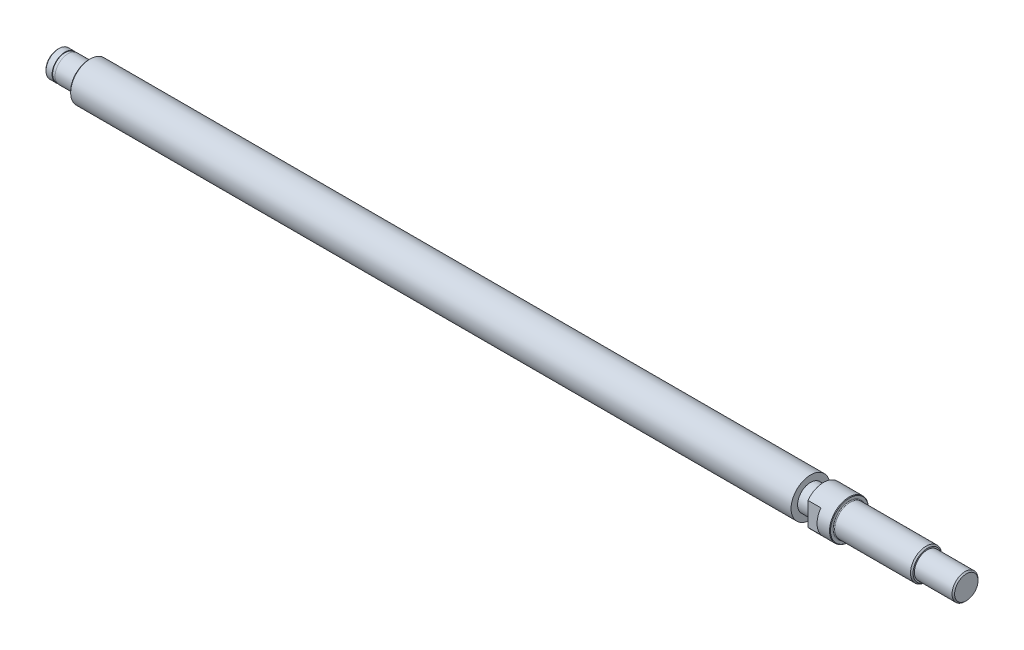
ISO-10303-21;
HEADER;
FILE_DESCRIPTION(('STEP AP214'),'2;1');
FILE_NAME('part.step','',(''),(''),'','','');
FILE_SCHEMA(('AUTOMOTIVE_DESIGN { 1 0 10303 214 1 1 1 1 }'));
ENDSEC;
DATA;
#1=APPLICATION_CONTEXT('core data for automotive mechanical design processes');
#2=APPLICATION_PROTOCOL_DEFINITION('international standard','automotive_design',2000,#1);
#3=PRODUCT_CONTEXT('',#1,'mechanical');
#4=PRODUCT('Part','Part','',(#3));
#5=PRODUCT_RELATED_PRODUCT_CATEGORY('part','',(#4));
#6=PRODUCT_DEFINITION_FORMATION('','',#4);
#7=PRODUCT_DEFINITION_CONTEXT('part definition',#1,'design');
#8=PRODUCT_DEFINITION('design','',#6,#7);
#9=PRODUCT_DEFINITION_SHAPE('','',#8);
#10=(LENGTH_UNIT() NAMED_UNIT(*) SI_UNIT(.MILLI.,.METRE.));
#11=(NAMED_UNIT(*) PLANE_ANGLE_UNIT() SI_UNIT($,.RADIAN.));
#12=(NAMED_UNIT(*) SI_UNIT($,.STERADIAN.) SOLID_ANGLE_UNIT());
#13=UNCERTAINTY_MEASURE_WITH_UNIT(LENGTH_MEASURE(1.E-05),#10,'distance_accuracy_value','');
#14=(GEOMETRIC_REPRESENTATION_CONTEXT(3) GLOBAL_UNCERTAINTY_ASSIGNED_CONTEXT((#13)) GLOBAL_UNIT_ASSIGNED_CONTEXT((#10,
#11,#12)) REPRESENTATION_CONTEXT('',''));
#15=CARTESIAN_POINT('',(0.,0.,0.));
#16=DIRECTION('',(0.,0.,1.));
#17=DIRECTION('',(1.,0.,0.));
#18=AXIS2_PLACEMENT_3D('',#15,#16,#17);
#19=CARTESIAN_POINT('',(295.,-7.66231773470438,6.));
#20=DIRECTION('',(-1.,0.,0.));
#21=DIRECTION('',(0.,1.,0.));
#22=AXIS2_PLACEMENT_3D('',#19,#20,#21);
#23=PLANE('',#22);
#24=CARTESIAN_POINT('',(295.,0.,0.));
#25=DIRECTION('',(-1.,0.,0.));
#26=DIRECTION('',(0.,0.6,0.8));
#27=AXIS2_PLACEMENT_3D('',#24,#25,#26);
#28=CIRCLE('',#27,7.5);
#29=CARTESIAN_POINT('',(295.,4.5,-6.));
#30=VERTEX_POINT('',#29);
#31=CARTESIAN_POINT('',(295.,4.5,6.));
#32=VERTEX_POINT('',#31);
#33=EDGE_CURVE('E56',#30,#32,#28,.F.);
#34=ORIENTED_EDGE('',*,*,#33,.F.);
#35=DIRECTION('',(0.,-1.,0.));
#36=VECTOR('',#35,1.);
#37=CARTESIAN_POINT('',(295.,4.5,-6.));
#38=LINE('',#37,#36);
#39=CARTESIAN_POINT('',(295.,-4.5,-6.));
#40=VERTEX_POINT('',#39);
#41=EDGE_CURVE('E70',#30,#40,#38,.T.);
#42=ORIENTED_EDGE('',*,*,#41,.T.);
#43=CARTESIAN_POINT('',(295.,0.,0.));
#44=DIRECTION('',(-1.,0.,0.));
#45=DIRECTION('',(0.,-0.6,-0.8));
#46=AXIS2_PLACEMENT_3D('',#43,#44,#45);
#47=CIRCLE('',#46,7.5);
#48=CARTESIAN_POINT('',(295.,-4.5,6.));
#49=VERTEX_POINT('',#48);
#50=EDGE_CURVE('E76',#49,#40,#47,.F.);
#51=ORIENTED_EDGE('',*,*,#50,.F.);
#52=DIRECTION('',(0.,1.,0.));
#53=VECTOR('',#52,1.);
#54=CARTESIAN_POINT('',(295.,-4.5,6.));
#55=LINE('',#54,#53);
#56=EDGE_CURVE('E72',#49,#32,#55,.T.);
#57=ORIENTED_EDGE('',*,*,#56,.T.);
#58=EDGE_LOOP('',(#34,#42,#51,#57));
#59=FACE_BOUND('',#58,.T.);
#60=CARTESIAN_POINT('',(295.,0.,0.));
#61=DIRECTION('',(1.,0.,0.));
#62=DIRECTION('',(0.,-1.42053906238006E-07,0.99999999999999));
#63=AXIS2_PLACEMENT_3D('',#60,#61,#62);
#64=CIRCLE('',#63,5.);
#65=CARTESIAN_POINT('',(295.,-7.10269531190032E-07,4.99999999999995));
#66=VERTEX_POINT('',#65);
#67=EDGE_CURVE('E87',#66,#66,#64,.T.);
#68=ORIENTED_EDGE('',*,*,#67,.T.);
#69=EDGE_LOOP('',(#68));
#70=FACE_BOUND('',#69,.T.);
#71=ADVANCED_FACE('F16',(#59,#70),#23,.T.);
#72=CARTESIAN_POINT('',(290.,-7.70492968244106,-7.5));
#73=DIRECTION('',(1.,0.,0.));
#74=DIRECTION('',(0.,1.,0.));
#75=AXIS2_PLACEMENT_3D('',#72,#73,#74);
#76=PLANE('',#75);
#77=CARTESIAN_POINT('',(290.,0.,0.));
#78=DIRECTION('',(1.,0.,0.));
#79=DIRECTION('',(0.,0.,1.));
#80=AXIS2_PLACEMENT_3D('',#77,#78,#79);
#81=CIRCLE('',#80,7.5);
#82=CARTESIAN_POINT('',(290.,0.,7.5));
#83=VERTEX_POINT('',#82);
#84=EDGE_CURVE('E92',#83,#83,#81,.T.);
#85=ORIENTED_EDGE('',*,*,#84,.T.);
#86=EDGE_LOOP('',(#85));
#87=FACE_BOUND('',#86,.T.);
#88=CARTESIAN_POINT('',(290.,0.,0.));
#89=DIRECTION('',(-1.,0.,0.));
#90=DIRECTION('',(0.,0.,-1.));
#91=AXIS2_PLACEMENT_3D('',#88,#89,#90);
#92=CIRCLE('',#91,5.);
#93=CARTESIAN_POINT('',(290.,0.,-5.));
#94=VERTEX_POINT('',#93);
#95=EDGE_CURVE('E95',#94,#94,#92,.F.);
#96=ORIENTED_EDGE('',*,*,#95,.F.);
#97=EDGE_LOOP('',(#96));
#98=FACE_BOUND('',#97,.T.);
#99=ADVANCED_FACE('F216',(#87,#98),#76,.T.);
#100=CARTESIAN_POINT('',(305.,-7.49946489090929,-7.3));
#101=DIRECTION('',(1.,0.,0.));
#102=DIRECTION('',(0.,1.,0.));
#103=AXIS2_PLACEMENT_3D('',#100,#101,#102);
#104=PLANE('',#103);
#105=CARTESIAN_POINT('',(305.,0.,0.));
#106=DIRECTION('',(1.,0.,0.));
#107=DIRECTION('',(0.,0.,1.));
#108=AXIS2_PLACEMENT_3D('',#105,#106,#107);
#109=CIRCLE('',#108,7.29999999999999);
#110=CARTESIAN_POINT('',(305.,0.,7.29999999999999));
#111=VERTEX_POINT('',#110);
#112=EDGE_CURVE('E98',#111,#111,#109,.T.);
#113=ORIENTED_EDGE('',*,*,#112,.T.);
#114=EDGE_LOOP('',(#113));
#115=FACE_BOUND('',#114,.T.);
#116=CARTESIAN_POINT('',(305.,0.,0.));
#117=DIRECTION('',(-1.,0.,0.));
#118=DIRECTION('',(0.,0.,-1.));
#119=AXIS2_PLACEMENT_3D('',#116,#117,#118);
#120=CIRCLE('',#119,6.30000007095759);
#121=CARTESIAN_POINT('',(305.,0.,-6.30000007095759));
#122=VERTEX_POINT('',#121);
#123=EDGE_CURVE('E101',#122,#122,#120,.F.);
#124=ORIENTED_EDGE('',*,*,#123,.F.);
#125=EDGE_LOOP('',(#124));
#126=FACE_BOUND('',#125,.T.);
#127=ADVANCED_FACE('F221',(#115,#126),#104,.T.);
#128=CARTESIAN_POINT('',(335.,-5.5,-5.5));
#129=DIRECTION('',(1.,0.,0.));
#130=DIRECTION('',(0.,1.,0.));
#131=AXIS2_PLACEMENT_3D('',#128,#129,#130);
#132=PLANE('',#131);
#133=CARTESIAN_POINT('',(335.,0.,0.));
#134=DIRECTION('',(1.,0.,0.));
#135=DIRECTION('',(0.,0.,1.));
#136=AXIS2_PLACEMENT_3D('',#133,#134,#135);
#137=CIRCLE('',#136,5.5);
#138=CARTESIAN_POINT('',(335.,0.,5.5));
#139=VERTEX_POINT('',#138);
#140=EDGE_CURVE('E104',#139,#139,#137,.T.);
#141=ORIENTED_EDGE('',*,*,#140,.T.);
#142=EDGE_LOOP('',(#141));
#143=FACE_BOUND('',#142,.T.);
#144=CARTESIAN_POINT('',(335.,0.,0.));
#145=DIRECTION('',(-1.,0.,0.));
#146=DIRECTION('',(0.,0.,-1.));
#147=AXIS2_PLACEMENT_3D('',#144,#145,#146);
#148=CIRCLE('',#147,5.);
#149=CARTESIAN_POINT('',(335.,0.,-5.));
#150=VERTEX_POINT('',#149);
#151=EDGE_CURVE('E107',#150,#150,#148,.F.);
#152=ORIENTED_EDGE('',*,*,#151,.F.);
#153=EDGE_LOOP('',(#152));
#154=FACE_BOUND('',#153,.T.);
#155=ADVANCED_FACE('F227',(#143,#154),#132,.T.);
#156=CARTESIAN_POINT('',(350.,-4.5,-4.5));
#157=DIRECTION('',(1.,0.,0.));
#158=DIRECTION('',(0.,1.,0.));
#159=AXIS2_PLACEMENT_3D('',#156,#157,#158);
#160=PLANE('',#159);
#161=CARTESIAN_POINT('',(350.,0.,0.));
#162=DIRECTION('',(1.,0.,0.));
#163=DIRECTION('',(0.,0.,1.));
#164=AXIS2_PLACEMENT_3D('',#161,#162,#163);
#165=CIRCLE('',#164,4.5);
#166=CARTESIAN_POINT('',(350.,0.,4.5));
#167=VERTEX_POINT('',#166);
#168=EDGE_CURVE('E110',#167,#167,#165,.T.);
#169=ORIENTED_EDGE('',*,*,#168,.T.);
#170=EDGE_LOOP('',(#169));
#171=FACE_BOUND('',#170,.T.);
#172=ADVANCED_FACE('F211',(#171),#160,.T.);
#173=CARTESIAN_POINT('',(12.,-7.19126770361166,7.));
#174=DIRECTION('',(-1.,0.,0.));
#175=DIRECTION('',(0.,1.,0.));
#176=AXIS2_PLACEMENT_3D('',#173,#174,#175);
#177=PLANE('',#176);
#178=CARTESIAN_POINT('',(12.,0.,0.));
#179=DIRECTION('',(-1.,0.,0.));
#180=DIRECTION('',(0.,0.,-1.));
#181=AXIS2_PLACEMENT_3D('',#178,#179,#180);
#182=CIRCLE('',#181,7.);
#183=CARTESIAN_POINT('',(12.,0.,-7.));
#184=VERTEX_POINT('',#183);
#185=EDGE_CURVE('E113',#184,#184,#182,.F.);
#186=ORIENTED_EDGE('',*,*,#185,.F.);
#187=EDGE_LOOP('',(#186));
#188=FACE_BOUND('',#187,.T.);
#189=CARTESIAN_POINT('',(12.,0.,0.));
#190=DIRECTION('',(1.,0.,0.));
#191=DIRECTION('',(0.,0.,1.));
#192=AXIS2_PLACEMENT_3D('',#189,#190,#191);
#193=CIRCLE('',#192,5.3);
#194=CARTESIAN_POINT('',(12.,0.,5.3));
#195=VERTEX_POINT('',#194);
#196=EDGE_CURVE('E116',#195,#195,#193,.T.);
#197=ORIENTED_EDGE('',*,*,#196,.T.);
#198=EDGE_LOOP('',(#197));
#199=FACE_BOUND('',#198,.T.);
#200=ADVANCED_FACE('F204',(#188,#199),#177,.T.);
#201=CARTESIAN_POINT('',(2.85,-4.99999975726073,-5.00000000000001));
#202=DIRECTION('',(1.,0.,0.));
#203=DIRECTION('',(0.,1.,0.));
#204=AXIS2_PLACEMENT_3D('',#201,#202,#203);
#205=PLANE('',#204);
#206=CARTESIAN_POINT('',(2.85,0.,0.));
#207=DIRECTION('',(1.,0.,0.));
#208=DIRECTION('',(0.,-1.42331253982776E-07,0.99999999999999));
#209=AXIS2_PLACEMENT_3D('',#206,#207,#208);
#210=CIRCLE('',#209,5.);
#211=CARTESIAN_POINT('',(2.85,-7.11656269913877E-07,4.99999999999995));
#212=VERTEX_POINT('',#211);
#213=EDGE_CURVE('E119',#212,#212,#210,.F.);
#214=ORIENTED_EDGE('',*,*,#213,.F.);
#215=EDGE_LOOP('',(#214));
#216=FACE_BOUND('',#215,.T.);
#217=CARTESIAN_POINT('',(2.85,0.,0.));
#218=DIRECTION('',(-1.,0.,0.));
#219=DIRECTION('',(0.,0.,-1.));
#220=AXIS2_PLACEMENT_3D('',#217,#218,#219);
#221=CIRCLE('',#220,4.8);
#222=CARTESIAN_POINT('',(2.85,0.,-4.8));
#223=VERTEX_POINT('',#222);
#224=EDGE_CURVE('E122',#223,#223,#221,.F.);
#225=ORIENTED_EDGE('',*,*,#224,.F.);
#226=EDGE_LOOP('',(#225));
#227=FACE_BOUND('',#226,.T.);
#228=ADVANCED_FACE('F191',(#216,#227),#205,.T.);
#229=CARTESIAN_POINT('',(4.,-5.,5.));
#230=DIRECTION('',(-1.,0.,0.));
#231=DIRECTION('',(0.,1.,0.));
#232=AXIS2_PLACEMENT_3D('',#229,#230,#231);
#233=PLANE('',#232);
#234=CARTESIAN_POINT('',(4.,0.,0.));
#235=DIRECTION('',(-1.,0.,0.));
#236=DIRECTION('',(0.,0.,-1.));
#237=AXIS2_PLACEMENT_3D('',#234,#235,#236);
#238=CIRCLE('',#237,5.);
#239=CARTESIAN_POINT('',(4.,0.,-5.));
#240=VERTEX_POINT('',#239);
#241=EDGE_CURVE('E125',#240,#240,#238,.F.);
#242=ORIENTED_EDGE('',*,*,#241,.F.);
#243=EDGE_LOOP('',(#242));
#244=FACE_BOUND('',#243,.T.);
#245=CARTESIAN_POINT('',(4.,0.,0.));
#246=DIRECTION('',(1.,0.,0.));
#247=DIRECTION('',(0.,-1.41766347920107E-07,0.99999999999999));
#248=AXIS2_PLACEMENT_3D('',#245,#246,#247);
#249=CIRCLE('',#248,4.8);
#250=CARTESIAN_POINT('',(4.,-6.80478470016513E-07,4.79999999999995));
#251=VERTEX_POINT('',#250);
#252=EDGE_CURVE('E128',#251,#251,#249,.T.);
#253=ORIENTED_EDGE('',*,*,#252,.T.);
#254=EDGE_LOOP('',(#253));
#255=FACE_BOUND('',#254,.T.);
#256=ADVANCED_FACE('F187',(#244,#255),#233,.T.);
#257=CARTESIAN_POINT('',(0.,-4.5,4.5));
#258=DIRECTION('',(-1.,0.,0.));
#259=DIRECTION('',(0.,1.,0.));
#260=AXIS2_PLACEMENT_3D('',#257,#258,#259);
#261=PLANE('',#260);
#262=CARTESIAN_POINT('',(0.,0.,0.));
#263=DIRECTION('',(-1.,0.,0.));
#264=DIRECTION('',(0.,0.,-1.));
#265=AXIS2_PLACEMENT_3D('',#262,#263,#264);
#266=CIRCLE('',#265,4.5);
#267=CARTESIAN_POINT('',(0.,0.,-4.5));
#268=VERTEX_POINT('',#267);
#269=EDGE_CURVE('E131',#268,#268,#266,.F.);
#270=ORIENTED_EDGE('',*,*,#269,.F.);
#271=EDGE_LOOP('',(#270));
#272=FACE_BOUND('',#271,.T.);
#273=ADVANCED_FACE('F190',(#272),#261,.T.);
#274=CARTESIAN_POINT('',(300.,-4.5,-6.));
#275=DIRECTION('',(-1.,0.,0.));
#276=DIRECTION('',(0.,1.,0.));
#277=AXIS2_PLACEMENT_3D('',#274,#275,#276);
#278=PLANE('',#277);
#279=DIRECTION('',(0.,1.,0.));
#280=VECTOR('',#279,1.);
#281=CARTESIAN_POINT('',(300.,-4.5,-6.));
#282=LINE('',#281,#280);
#283=CARTESIAN_POINT('',(300.,4.5,-6.));
#284=VERTEX_POINT('',#283);
#285=CARTESIAN_POINT('',(300.,-4.5,-6.));
#286=VERTEX_POINT('',#285);
#287=EDGE_CURVE('E134',#284,#286,#282,.F.);
#288=ORIENTED_EDGE('',*,*,#287,.F.);
#289=CARTESIAN_POINT('',(300.,0.,0.));
#290=DIRECTION('',(-1.,0.,0.));
#291=DIRECTION('',(0.,0.,-1.));
#292=AXIS2_PLACEMENT_3D('',#289,#290,#291);
#293=CIRCLE('',#292,7.5);
#294=EDGE_CURVE('E58',#286,#284,#293,.F.);
#295=ORIENTED_EDGE('',*,*,#294,.F.);
#296=EDGE_LOOP('',(#288,#295));
#297=FACE_BOUND('',#296,.T.);
#298=ADVANCED_FACE('F274',(#297),#278,.T.);
#299=CARTESIAN_POINT('',(300.,-4.5,-6.));
#300=DIRECTION('',(0.,0.,-1.));
#301=DIRECTION('',(-1.,0.,0.));
#302=AXIS2_PLACEMENT_3D('',#299,#300,#301);
#303=PLANE('',#302);
#304=DIRECTION('',(1.,0.,0.));
#305=VECTOR('',#304,1.);
#306=CARTESIAN_POINT('',(295.,4.5,-6.));
#307=LINE('',#306,#305);
#308=EDGE_CURVE('E53',#30,#284,#307,.T.);
#309=ORIENTED_EDGE('',*,*,#308,.T.);
#310=ORIENTED_EDGE('',*,*,#287,.T.);
#311=DIRECTION('',(-1.,0.,0.));
#312=VECTOR('',#311,1.);
#313=CARTESIAN_POINT('',(300.,-4.5,-6.));
#314=LINE('',#313,#312);
#315=EDGE_CURVE('E63',#286,#40,#314,.T.);
#316=ORIENTED_EDGE('',*,*,#315,.T.);
#317=ORIENTED_EDGE('',*,*,#41,.F.);
#318=EDGE_LOOP('',(#309,#310,#316,#317));
#319=FACE_BOUND('',#318,.T.);
#320=ADVANCED_FACE('F75',(#319),#303,.T.);
#321=CARTESIAN_POINT('',(295.,-4.5,6.));
#322=DIRECTION('',(0.,0.,1.));
#323=DIRECTION('',(1.,0.,0.));
#324=AXIS2_PLACEMENT_3D('',#321,#322,#323);
#325=PLANE('',#324);
#326=DIRECTION('',(1.,0.,0.));
#327=VECTOR('',#326,1.);
#328=CARTESIAN_POINT('',(295.,-4.5,6.));
#329=LINE('',#328,#327);
#330=CARTESIAN_POINT('',(300.,-4.5,6.));
#331=VERTEX_POINT('',#330);
#332=EDGE_CURVE('E144',#49,#331,#329,.T.);
#333=ORIENTED_EDGE('',*,*,#332,.T.);
#334=DIRECTION('',(0.,1.,0.));
#335=VECTOR('',#334,1.);
#336=CARTESIAN_POINT('',(300.,-4.5,6.));
#337=LINE('',#336,#335);
#338=CARTESIAN_POINT('',(300.,4.5,6.));
#339=VERTEX_POINT('',#338);
#340=EDGE_CURVE('E148',#331,#339,#337,.T.);
#341=ORIENTED_EDGE('',*,*,#340,.T.);
#342=DIRECTION('',(-1.,0.,0.));
#343=VECTOR('',#342,1.);
#344=CARTESIAN_POINT('',(300.,4.5,6.));
#345=LINE('',#344,#343);
#346=EDGE_CURVE('E31',#339,#32,#345,.T.);
#347=ORIENTED_EDGE('',*,*,#346,.T.);
#348=ORIENTED_EDGE('',*,*,#56,.F.);
#349=EDGE_LOOP('',(#333,#341,#347,#348));
#350=FACE_BOUND('',#349,.T.);
#351=ADVANCED_FACE('F284',(#350),#325,.T.);
#352=CARTESIAN_POINT('',(300.,-4.5,7.5));
#353=DIRECTION('',(-1.,0.,0.));
#354=DIRECTION('',(0.,1.,0.));
#355=AXIS2_PLACEMENT_3D('',#352,#353,#354);
#356=PLANE('',#355);
#357=ORIENTED_EDGE('',*,*,#340,.F.);
#358=CARTESIAN_POINT('',(300.,0.,0.));
#359=DIRECTION('',(-1.,0.,0.));
#360=DIRECTION('',(0.,0.,1.));
#361=AXIS2_PLACEMENT_3D('',#358,#359,#360);
#362=CIRCLE('',#361,7.5);
#363=EDGE_CURVE('E35',#339,#331,#362,.F.);
#364=ORIENTED_EDGE('',*,*,#363,.F.);
#365=EDGE_LOOP('',(#357,#364));
#366=FACE_BOUND('',#365,.T.);
#367=ADVANCED_FACE('F287',(#366),#356,.T.);
#368=CARTESIAN_POINT('',(350.,0.,0.));
#369=DIRECTION('',(1.,0.,0.));
#370=DIRECTION('',(0.,0.,1.));
#371=AXIS2_PLACEMENT_3D('',#368,#369,#370);
#372=CYLINDRICAL_SURFACE('',#371,7.5);
#373=CARTESIAN_POINT('',(304.8,0.,0.));
#374=DIRECTION('',(-1.,0.,0.));
#375=DIRECTION('',(0.,0.,-1.));
#376=AXIS2_PLACEMENT_3D('',#373,#374,#375);
#377=CIRCLE('',#376,7.5);
#378=CARTESIAN_POINT('',(304.8,0.,-7.5));
#379=VERTEX_POINT('',#378);
#380=EDGE_CURVE('E159',#379,#379,#377,.F.);
#381=ORIENTED_EDGE('',*,*,#380,.F.);
#382=EDGE_LOOP('',(#381));
#383=FACE_BOUND('',#382,.T.);
#384=ORIENTED_EDGE('',*,*,#332,.F.);
#385=ORIENTED_EDGE('',*,*,#50,.T.);
#386=ORIENTED_EDGE('',*,*,#315,.F.);
#387=ORIENTED_EDGE('',*,*,#294,.T.);
#388=ORIENTED_EDGE('',*,*,#308,.F.);
#389=ORIENTED_EDGE('',*,*,#33,.T.);
#390=ORIENTED_EDGE('',*,*,#346,.F.);
#391=ORIENTED_EDGE('',*,*,#363,.T.);
#392=EDGE_LOOP('',(#384,#385,#386,#387,#388,#389,#390,#391));
#393=FACE_BOUND('',#392,.T.);
#394=ADVANCED_FACE('F55',(#383,#393),#372,.T.);
#395=CARTESIAN_POINT('',(350.,0.,0.));
#396=DIRECTION('',(1.,0.,0.));
#397=DIRECTION('',(0.,0.,1.));
#398=AXIS2_PLACEMENT_3D('',#395,#396,#397);
#399=CYLINDRICAL_SURFACE('',#398,7.5);
#400=ORIENTED_EDGE('',*,*,#84,.F.);
#401=EDGE_LOOP('',(#400));
#402=FACE_BOUND('',#401,.T.);
#403=CARTESIAN_POINT('',(12.5,0.,0.));
#404=DIRECTION('',(1.,0.,0.));
#405=DIRECTION('',(0.,0.,1.));
#406=AXIS2_PLACEMENT_3D('',#403,#404,#405);
#407=CIRCLE('',#406,7.5);
#408=CARTESIAN_POINT('',(12.5,0.,7.5));
#409=VERTEX_POINT('',#408);
#410=EDGE_CURVE('E164',#409,#409,#407,.T.);
#411=ORIENTED_EDGE('',*,*,#410,.T.);
#412=EDGE_LOOP('',(#411));
#413=FACE_BOUND('',#412,.T.);
#414=ADVANCED_FACE('F294',(#402,#413),#399,.T.);
#415=CARTESIAN_POINT('',(350.,0.,0.));
#416=DIRECTION('',(1.,0.,0.));
#417=DIRECTION('',(0.,0.,1.));
#418=AXIS2_PLACEMENT_3D('',#415,#416,#417);
#419=CYLINDRICAL_SURFACE('',#418,5.);
#420=ORIENTED_EDGE('',*,*,#67,.F.);
#421=EDGE_LOOP('',(#420));
#422=FACE_BOUND('',#421,.T.);
#423=ORIENTED_EDGE('',*,*,#95,.T.);
#424=EDGE_LOOP('',(#423));
#425=FACE_BOUND('',#424,.T.);
#426=ADVANCED_FACE('F298',(#422,#425),#419,.T.);
#427=CARTESIAN_POINT('',(304.8,0.,0.));
#428=DIRECTION('',(-1.,0.,0.));
#429=DIRECTION('',(0.,0.,-1.));
#430=AXIS2_PLACEMENT_3D('',#427,#428,#429);
#431=CONICAL_SURFACE('',#430,7.5,0.785398163397501);
#432=ORIENTED_EDGE('',*,*,#112,.F.);
#433=EDGE_LOOP('',(#432));
#434=FACE_BOUND('',#433,.T.);
#435=ORIENTED_EDGE('',*,*,#380,.T.);
#436=EDGE_LOOP('',(#435));
#437=FACE_BOUND('',#436,.T.);
#438=ADVANCED_FACE('F302',(#434,#437),#431,.T.);
#439=CARTESIAN_POINT('',(305.299999999993,0.,0.));
#440=DIRECTION('',(1.,0.,0.));
#441=DIRECTION('',(0.,1.92332050626273E-10,1.));
#442=AXIS2_PLACEMENT_3D('',#439,#440,#441);
#443=TOROIDAL_SURFACE('',#442,6.29999999999301,0.299999999993028);
#444=CARTESIAN_POINT('',(305.3,0.,0.));
#445=DIRECTION('',(-1.,0.,0.));
#446=DIRECTION('',(0.,0.,-1.));
#447=AXIS2_PLACEMENT_3D('',#444,#445,#446);
#448=CIRCLE('',#447,5.99999999999998);
#449=CARTESIAN_POINT('',(305.3,0.,-5.99999999999998));
#450=VERTEX_POINT('',#449);
#451=EDGE_CURVE('E167',#450,#450,#448,.F.);
#452=ORIENTED_EDGE('',*,*,#451,.F.);
#453=EDGE_LOOP('',(#452));
#454=FACE_BOUND('',#453,.T.);
#455=ORIENTED_EDGE('',*,*,#123,.T.);
#456=EDGE_LOOP('',(#455));
#457=FACE_BOUND('',#456,.T.);
#458=ADVANCED_FACE('F306',(#454,#457),#443,.F.);
#459=CARTESIAN_POINT('',(350.,0.,0.));
#460=DIRECTION('',(1.,0.,0.));
#461=DIRECTION('',(0.,7.69327835111053E-10,1.));
#462=AXIS2_PLACEMENT_3D('',#459,#460,#461);
#463=CYLINDRICAL_SURFACE('',#462,6.);
#464=CARTESIAN_POINT('',(334.5,0.,0.));
#465=DIRECTION('',(-1.,0.,0.));
#466=DIRECTION('',(0.,0.,-1.));
#467=AXIS2_PLACEMENT_3D('',#464,#465,#466);
#468=CIRCLE('',#467,6.);
#469=CARTESIAN_POINT('',(334.5,0.,-6.));
#470=VERTEX_POINT('',#469);
#471=EDGE_CURVE('E170',#470,#470,#468,.F.);
#472=ORIENTED_EDGE('',*,*,#471,.F.);
#473=EDGE_LOOP('',(#472));
#474=FACE_BOUND('',#473,.T.);
#475=ORIENTED_EDGE('',*,*,#451,.T.);
#476=EDGE_LOOP('',(#475));
#477=FACE_BOUND('',#476,.T.);
#478=ADVANCED_FACE('F253',(#474,#477),#463,.T.);
#479=CARTESIAN_POINT('',(334.5,0.,0.));
#480=DIRECTION('',(-1.,0.,0.));
#481=DIRECTION('',(0.,0.,-1.));
#482=AXIS2_PLACEMENT_3D('',#479,#480,#481);
#483=CONICAL_SURFACE('',#482,6.,0.785398163397447);
#484=ORIENTED_EDGE('',*,*,#140,.F.);
#485=EDGE_LOOP('',(#484));
#486=FACE_BOUND('',#485,.T.);
#487=ORIENTED_EDGE('',*,*,#471,.T.);
#488=EDGE_LOOP('',(#487));
#489=FACE_BOUND('',#488,.T.);
#490=ADVANCED_FACE('F246',(#486,#489),#483,.T.);
#491=CARTESIAN_POINT('',(350.,0.,0.));
#492=DIRECTION('',(1.,0.,0.));
#493=DIRECTION('',(0.,0.,1.));
#494=AXIS2_PLACEMENT_3D('',#491,#492,#493);
#495=CYLINDRICAL_SURFACE('',#494,5.);
#496=CARTESIAN_POINT('',(349.5,0.,0.));
#497=DIRECTION('',(-1.,0.,0.));
#498=DIRECTION('',(0.,0.,-1.));
#499=AXIS2_PLACEMENT_3D('',#496,#497,#498);
#500=CIRCLE('',#499,5.);
#501=CARTESIAN_POINT('',(349.5,0.,-5.));
#502=VERTEX_POINT('',#501);
#503=EDGE_CURVE('E173',#502,#502,#500,.F.);
#504=ORIENTED_EDGE('',*,*,#503,.F.);
#505=EDGE_LOOP('',(#504));
#506=FACE_BOUND('',#505,.T.);
#507=ORIENTED_EDGE('',*,*,#151,.T.);
#508=EDGE_LOOP('',(#507));
#509=FACE_BOUND('',#508,.T.);
#510=ADVANCED_FACE('F240',(#506,#509),#495,.T.);
#511=CARTESIAN_POINT('',(349.5,0.,0.));
#512=DIRECTION('',(-1.,0.,0.));
#513=DIRECTION('',(0.,0.,-1.));
#514=AXIS2_PLACEMENT_3D('',#511,#512,#513);
#515=CONICAL_SURFACE('',#514,5.,0.785398163397447);
#516=ORIENTED_EDGE('',*,*,#168,.F.);
#517=EDGE_LOOP('',(#516));
#518=FACE_BOUND('',#517,.T.);
#519=ORIENTED_EDGE('',*,*,#503,.T.);
#520=EDGE_LOOP('',(#519));
#521=FACE_BOUND('',#520,.T.);
#522=ADVANCED_FACE('F183',(#518,#521),#515,.T.);
#523=CARTESIAN_POINT('',(12.,0.,0.));
#524=DIRECTION('',(1.,0.,0.));
#525=DIRECTION('',(0.,1.92343152856519E-10,1.));
#526=AXIS2_PLACEMENT_3D('',#523,#524,#525);
#527=CYLINDRICAL_SURFACE('',#526,5.);
#528=CARTESIAN_POINT('',(11.7,0.,0.));
#529=DIRECTION('',(-1.,0.,0.));
#530=DIRECTION('',(0.,0.,-1.));
#531=AXIS2_PLACEMENT_3D('',#528,#529,#530);
#532=CIRCLE('',#531,5.);
#533=CARTESIAN_POINT('',(11.7,0.,-5.));
#534=VERTEX_POINT('',#533);
#535=EDGE_CURVE('E24',#534,#534,#532,.F.);
#536=ORIENTED_EDGE('',*,*,#535,.F.);
#537=EDGE_LOOP('',(#536));
#538=FACE_BOUND('',#537,.T.);
#539=ORIENTED_EDGE('',*,*,#241,.T.);
#540=EDGE_LOOP('',(#539));
#541=FACE_BOUND('',#540,.T.);
#542=ADVANCED_FACE('F180',(#538,#541),#527,.T.);
#543=CARTESIAN_POINT('',(11.7000000000001,0.,0.));
#544=DIRECTION('',(1.,0.,0.));
#545=DIRECTION('',(0.,1.92343152856519E-10,1.));
#546=AXIS2_PLACEMENT_3D('',#543,#544,#545);
#547=TOROIDAL_SURFACE('',#546,5.29999999999988,0.299999999999875);
#548=ORIENTED_EDGE('',*,*,#196,.F.);
#549=EDGE_LOOP('',(#548));
#550=FACE_BOUND('',#549,.T.);
#551=ORIENTED_EDGE('',*,*,#535,.T.);
#552=EDGE_LOOP('',(#551));
#553=FACE_BOUND('',#552,.T.);
#554=ADVANCED_FACE('F178',(#550,#553),#547,.F.);
#555=CARTESIAN_POINT('',(12.5,0.,0.));
#556=DIRECTION('',(1.,0.,0.));
#557=DIRECTION('',(0.,0.,1.));
#558=AXIS2_PLACEMENT_3D('',#555,#556,#557);
#559=CONICAL_SURFACE('',#558,7.5,0.785398163397447);
#560=ORIENTED_EDGE('',*,*,#185,.T.);
#561=EDGE_LOOP('',(#560));
#562=FACE_BOUND('',#561,.T.);
#563=ORIENTED_EDGE('',*,*,#410,.F.);
#564=EDGE_LOOP('',(#563));
#565=FACE_BOUND('',#564,.T.);
#566=ADVANCED_FACE('F199',(#562,#565),#559,.T.);
#567=CARTESIAN_POINT('',(10.,0.,0.));
#568=DIRECTION('',(1.,0.,0.));
#569=DIRECTION('',(0.,0.,1.));
#570=AXIS2_PLACEMENT_3D('',#567,#568,#569);
#571=CYLINDRICAL_SURFACE('',#570,4.8);
#572=ORIENTED_EDGE('',*,*,#252,.F.);
#573=EDGE_LOOP('',(#572));
#574=FACE_BOUND('',#573,.T.);
#575=ORIENTED_EDGE('',*,*,#224,.T.);
#576=EDGE_LOOP('',(#575));
#577=FACE_BOUND('',#576,.T.);
#578=ADVANCED_FACE('F195',(#574,#577),#571,.T.);
#579=CARTESIAN_POINT('',(0.5,0.,0.));
#580=DIRECTION('',(1.,0.,0.));
#581=DIRECTION('',(0.,1.92343152856519E-10,1.));
#582=AXIS2_PLACEMENT_3D('',#579,#580,#581);
#583=CONICAL_SURFACE('',#582,5.,0.785398163397448);
#584=CARTESIAN_POINT('',(0.5,0.,0.));
#585=DIRECTION('',(-1.,0.,0.));
#586=DIRECTION('',(0.,0.,-1.));
#587=AXIS2_PLACEMENT_3D('',#584,#585,#586);
#588=CIRCLE('',#587,5.);
#589=CARTESIAN_POINT('',(0.5,0.,-5.));
#590=VERTEX_POINT('',#589);
#591=EDGE_CURVE('E11',#590,#590,#588,.F.);
#592=ORIENTED_EDGE('',*,*,#591,.F.);
#593=EDGE_LOOP('',(#592));
#594=FACE_BOUND('',#593,.T.);
#595=ORIENTED_EDGE('',*,*,#269,.T.);
#596=EDGE_LOOP('',(#595));
#597=FACE_BOUND('',#596,.T.);
#598=ADVANCED_FACE('F198',(#594,#597),#583,.T.);
#599=CARTESIAN_POINT('',(12.,0.,0.));
#600=DIRECTION('',(1.,0.,0.));
#601=DIRECTION('',(0.,7.69370911764408E-10,1.));
#602=AXIS2_PLACEMENT_3D('',#599,#600,#601);
#603=CYLINDRICAL_SURFACE('',#602,5.);
#604=ORIENTED_EDGE('',*,*,#213,.T.);
#605=EDGE_LOOP('',(#604));
#606=FACE_BOUND('',#605,.T.);
#607=ORIENTED_EDGE('',*,*,#591,.T.);
#608=EDGE_LOOP('',(#607));
#609=FACE_BOUND('',#608,.T.);
#610=ADVANCED_FACE('F18',(#606,#609),#603,.T.);
#611=CLOSED_SHELL('',(#71,#99,#127,#155,#172,#200,#228,#256,#273,#298,#320,#351,#367,#394,#414,
#426,#438,#458,#478,#490,#510,#522,#542,#554,#566,#578,#598,#610));
#612=MANIFOLD_SOLID_BREP('B1',#611);
#613=ADVANCED_BREP_SHAPE_REPRESENTATION('',(#18,#612),#14);
#614=SHAPE_DEFINITION_REPRESENTATION(#9,#613);
ENDSEC;
END-ISO-10303-21;
